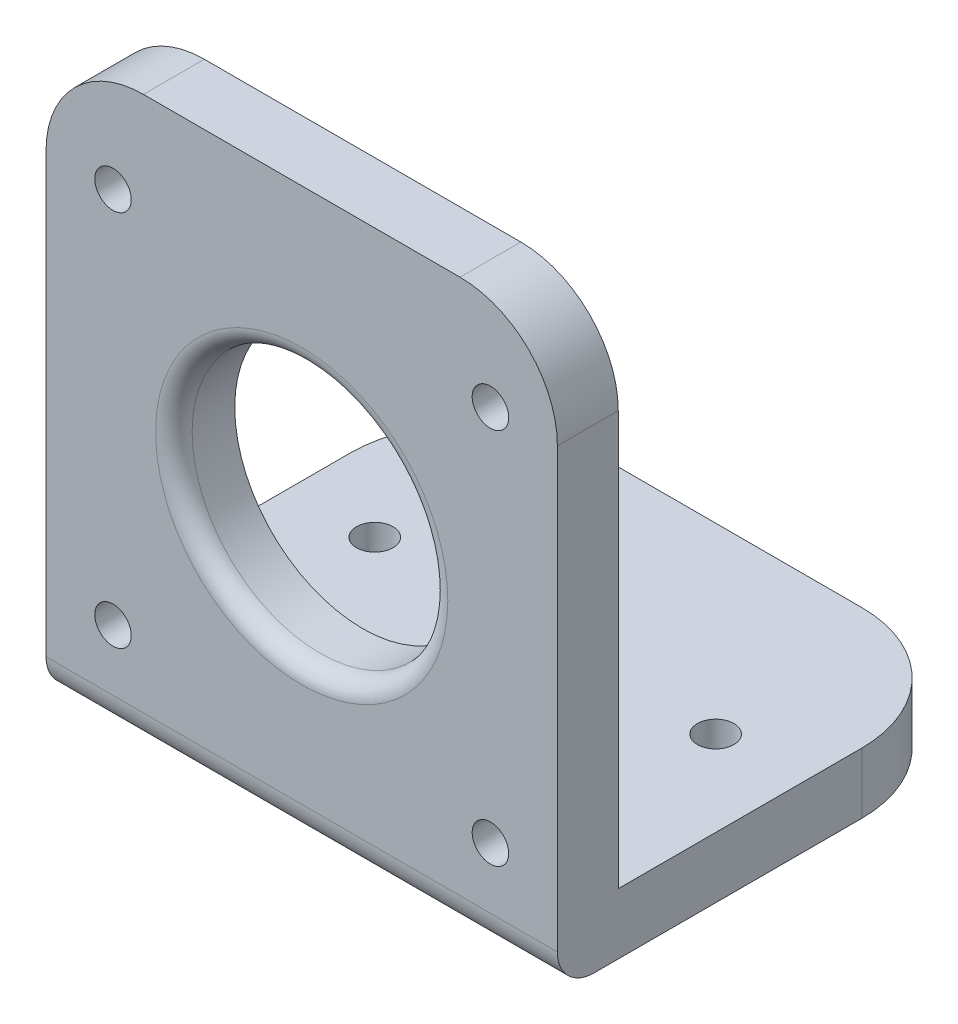
ISO-10303-21;
HEADER;
FILE_DESCRIPTION(('STEP AP214'),'2;1');
FILE_NAME('part.step','',(''),(''),'','','');
FILE_SCHEMA(('AUTOMOTIVE_DESIGN { 1 0 10303 214 1 1 1 1 }'));
ENDSEC;
DATA;
#1=APPLICATION_CONTEXT('core data for automotive mechanical design processes');
#2=APPLICATION_PROTOCOL_DEFINITION('international standard','automotive_design',2000,#1);
#3=PRODUCT_CONTEXT('',#1,'mechanical');
#4=PRODUCT('Part','Part','',(#3));
#5=PRODUCT_RELATED_PRODUCT_CATEGORY('part','',(#4));
#6=PRODUCT_DEFINITION_FORMATION('','',#4);
#7=PRODUCT_DEFINITION_CONTEXT('part definition',#1,'design');
#8=PRODUCT_DEFINITION('design','',#6,#7);
#9=PRODUCT_DEFINITION_SHAPE('','',#8);
#10=(LENGTH_UNIT() NAMED_UNIT(*) SI_UNIT(.MILLI.,.METRE.));
#11=(NAMED_UNIT(*) PLANE_ANGLE_UNIT() SI_UNIT($,.RADIAN.));
#12=(NAMED_UNIT(*) SI_UNIT($,.STERADIAN.) SOLID_ANGLE_UNIT());
#13=UNCERTAINTY_MEASURE_WITH_UNIT(LENGTH_MEASURE(1.E-05),#10,'distance_accuracy_value','');
#14=(GEOMETRIC_REPRESENTATION_CONTEXT(3) GLOBAL_UNCERTAINTY_ASSIGNED_CONTEXT((#13)) GLOBAL_UNIT_ASSIGNED_CONTEXT((#10,
#11,#12)) REPRESENTATION_CONTEXT('',''));
#15=CARTESIAN_POINT('',(0.,0.,0.));
#16=DIRECTION('',(0.,0.,1.));
#17=DIRECTION('',(1.,0.,0.));
#18=AXIS2_PLACEMENT_3D('',#15,#16,#17);
#19=CARTESIAN_POINT('',(-13.,15.5,0.));
#20=DIRECTION('',(0.,0.,1.));
#21=DIRECTION('',(1.,0.,0.));
#22=AXIS2_PLACEMENT_3D('',#19,#20,#21);
#23=PLANE('',#22);
#24=CARTESIAN_POINT('',(-15.5,15.5,0.));
#25=DIRECTION('',(0.,0.,-1.));
#26=DIRECTION('',(-1.,0.,0.));
#27=AXIS2_PLACEMENT_3D('',#24,#25,#26);
#28=CIRCLE('',#27,1.5);
#29=CARTESIAN_POINT('',(-17.,15.5,0.));
#30=VERTEX_POINT('',#29);
#31=EDGE_CURVE('E473',#30,#30,#28,.T.);
#32=ORIENTED_EDGE('',*,*,#31,.F.);
#33=EDGE_LOOP('',(#32));
#34=FACE_BOUND('',#33,.T.);
#35=CARTESIAN_POINT('',(15.4999996870756,-15.5000003129244,0.));
#36=DIRECTION('',(0.,0.,-1.));
#37=DIRECTION('',(-1.,0.,0.));
#38=AXIS2_PLACEMENT_3D('',#35,#36,#37);
#39=CIRCLE('',#38,1.49999957892929);
#40=CARTESIAN_POINT('',(14.0000001081463,-15.5000003129244,0.));
#41=VERTEX_POINT('',#40);
#42=EDGE_CURVE('E466',#41,#41,#39,.T.);
#43=ORIENTED_EDGE('',*,*,#42,.F.);
#44=EDGE_LOOP('',(#43));
#45=FACE_BOUND('',#44,.T.);
#46=CARTESIAN_POINT('',(-15.5,-15.5,0.));
#47=DIRECTION('',(0.,0.,-1.));
#48=DIRECTION('',(-1.,0.,0.));
#49=AXIS2_PLACEMENT_3D('',#46,#47,#48);
#50=CIRCLE('',#49,1.5);
#51=CARTESIAN_POINT('',(-17.,-15.5,0.));
#52=VERTEX_POINT('',#51);
#53=EDGE_CURVE('E478',#52,#52,#50,.T.);
#54=ORIENTED_EDGE('',*,*,#53,.F.);
#55=EDGE_LOOP('',(#54));
#56=FACE_BOUND('',#55,.T.);
#57=CARTESIAN_POINT('',(15.5,15.5,0.));
#58=DIRECTION('',(0.,0.,-1.));
#59=DIRECTION('',(-1.,0.,0.));
#60=AXIS2_PLACEMENT_3D('',#57,#58,#59);
#61=CIRCLE('',#60,1.5);
#62=CARTESIAN_POINT('',(14.,15.5,0.));
#63=VERTEX_POINT('',#62);
#64=EDGE_CURVE('E460',#63,#63,#61,.T.);
#65=ORIENTED_EDGE('',*,*,#64,.F.);
#66=EDGE_LOOP('',(#65));
#67=FACE_BOUND('',#66,.T.);
#68=CARTESIAN_POINT('',(0.,0.,0.));
#69=DIRECTION('',(0.,0.,1.));
#70=DIRECTION('',(1.,0.,0.));
#71=AXIS2_PLACEMENT_3D('',#68,#69,#70);
#72=CIRCLE('',#71,10.5);
#73=CARTESIAN_POINT('',(10.5,0.,0.));
#74=VERTEX_POINT('',#73);
#75=EDGE_CURVE('E136',#74,#74,#72,.T.);
#76=ORIENTED_EDGE('',*,*,#75,.T.);
#77=EDGE_LOOP('',(#76));
#78=FACE_BOUND('',#77,.T.);
#79=DIRECTION('',(1.,0.,0.));
#80=VECTOR('',#79,1.);
#81=CARTESIAN_POINT('',(21.,-18.5,0.));
#82=LINE('',#81,#80);
#83=CARTESIAN_POINT('',(-21.,-18.5,0.));
#84=VERTEX_POINT('',#83);
#85=CARTESIAN_POINT('',(21.,-18.5,0.));
#86=VERTEX_POINT('',#85);
#87=EDGE_CURVE('E131',#84,#86,#82,.T.);
#88=ORIENTED_EDGE('',*,*,#87,.F.);
#89=DIRECTION('',(0.,-1.,0.));
#90=VECTOR('',#89,1.);
#91=CARTESIAN_POINT('',(-21.,15.4999999999999,0.));
#92=LINE('',#91,#90);
#93=CARTESIAN_POINT('',(-21.,15.4999999999999,0.));
#94=VERTEX_POINT('',#93);
#95=EDGE_CURVE('E156',#94,#84,#92,.T.);
#96=ORIENTED_EDGE('',*,*,#95,.F.);
#97=CARTESIAN_POINT('',(-13.,15.5,0.));
#98=DIRECTION('',(0.,0.,1.));
#99=DIRECTION('',(1.,0.,0.));
#100=AXIS2_PLACEMENT_3D('',#97,#98,#99);
#101=CIRCLE('',#100,8.);
#102=CARTESIAN_POINT('',(-12.9999999999999,23.5,0.));
#103=VERTEX_POINT('',#102);
#104=EDGE_CURVE('E169',#103,#94,#101,.T.);
#105=ORIENTED_EDGE('',*,*,#104,.F.);
#106=DIRECTION('',(-1.,0.,0.));
#107=VECTOR('',#106,1.);
#108=CARTESIAN_POINT('',(-12.9999999999999,23.5,0.));
#109=LINE('',#108,#107);
#110=CARTESIAN_POINT('',(12.9999999999999,23.5,0.));
#111=VERTEX_POINT('',#110);
#112=EDGE_CURVE('E167',#111,#103,#109,.T.);
#113=ORIENTED_EDGE('',*,*,#112,.F.);
#114=CARTESIAN_POINT('',(13.,15.5,0.));
#115=DIRECTION('',(0.,0.,1.));
#116=DIRECTION('',(-1.,0.,0.));
#117=AXIS2_PLACEMENT_3D('',#114,#115,#116);
#118=CIRCLE('',#117,8.);
#119=CARTESIAN_POINT('',(21.,15.4999999999999,0.));
#120=VERTEX_POINT('',#119);
#121=EDGE_CURVE('E134',#120,#111,#118,.T.);
#122=ORIENTED_EDGE('',*,*,#121,.F.);
#123=DIRECTION('',(0.,1.,0.));
#124=VECTOR('',#123,1.);
#125=CARTESIAN_POINT('',(21.,15.4999999999999,0.));
#126=LINE('',#125,#124);
#127=EDGE_CURVE('E118',#86,#120,#126,.T.);
#128=ORIENTED_EDGE('',*,*,#127,.F.);
#129=EDGE_LOOP('',(#88,#96,#105,#113,#122,#128));
#130=FACE_BOUND('',#129,.T.);
#131=ADVANCED_FACE('F33',(#34,#45,#56,#67,#78,#130),#23,.F.);
#132=CARTESIAN_POINT('',(-13.,15.5,5.));
#133=DIRECTION('',(0.,0.,1.));
#134=DIRECTION('',(1.,0.,0.));
#135=AXIS2_PLACEMENT_3D('',#132,#133,#134);
#136=PLANE('',#135);
#137=CARTESIAN_POINT('',(0.,0.,5.));
#138=DIRECTION('',(0.,0.,1.));
#139=DIRECTION('',(1.,0.,0.));
#140=AXIS2_PLACEMENT_3D('',#137,#138,#139);
#141=CIRCLE('',#140,12.);
#142=CARTESIAN_POINT('',(12.,0.,5.));
#143=VERTEX_POINT('',#142);
#144=EDGE_CURVE('E11',#143,#143,#141,.F.);
#145=ORIENTED_EDGE('',*,*,#144,.T.);
#146=EDGE_LOOP('',(#145));
#147=FACE_BOUND('',#146,.T.);
#148=CARTESIAN_POINT('',(-15.5,15.5,5.));
#149=DIRECTION('',(0.,0.,-1.));
#150=DIRECTION('',(-1.,0.,0.));
#151=AXIS2_PLACEMENT_3D('',#148,#149,#150);
#152=CIRCLE('',#151,1.5);
#153=CARTESIAN_POINT('',(-17.,15.5,5.));
#154=VERTEX_POINT('',#153);
#155=EDGE_CURVE('E463',#154,#154,#152,.T.);
#156=ORIENTED_EDGE('',*,*,#155,.T.);
#157=EDGE_LOOP('',(#156));
#158=FACE_BOUND('',#157,.T.);
#159=CARTESIAN_POINT('',(15.4999996870756,-15.5000003129244,5.));
#160=DIRECTION('',(0.,0.,-1.));
#161=DIRECTION('',(-1.,0.,0.));
#162=AXIS2_PLACEMENT_3D('',#159,#160,#161);
#163=CIRCLE('',#162,1.49999957892929);
#164=CARTESIAN_POINT('',(14.0000001081463,-15.5000003129244,5.));
#165=VERTEX_POINT('',#164);
#166=EDGE_CURVE('E469',#165,#165,#163,.T.);
#167=ORIENTED_EDGE('',*,*,#166,.T.);
#168=EDGE_LOOP('',(#167));
#169=FACE_BOUND('',#168,.T.);
#170=CARTESIAN_POINT('',(-15.5,-15.5,5.));
#171=DIRECTION('',(0.,0.,-1.));
#172=DIRECTION('',(-1.,0.,0.));
#173=AXIS2_PLACEMENT_3D('',#170,#171,#172);
#174=CIRCLE('',#173,1.5);
#175=CARTESIAN_POINT('',(-17.,-15.5,5.));
#176=VERTEX_POINT('',#175);
#177=EDGE_CURVE('E470',#176,#176,#174,.T.);
#178=ORIENTED_EDGE('',*,*,#177,.T.);
#179=EDGE_LOOP('',(#178));
#180=FACE_BOUND('',#179,.T.);
#181=CARTESIAN_POINT('',(15.5,15.5,5.));
#182=DIRECTION('',(0.,0.,-1.));
#183=DIRECTION('',(-1.,0.,0.));
#184=AXIS2_PLACEMENT_3D('',#181,#182,#183);
#185=CIRCLE('',#184,1.5);
#186=CARTESIAN_POINT('',(14.,15.5,5.));
#187=VERTEX_POINT('',#186);
#188=EDGE_CURVE('E458',#187,#187,#185,.T.);
#189=ORIENTED_EDGE('',*,*,#188,.T.);
#190=EDGE_LOOP('',(#189));
#191=FACE_BOUND('',#190,.T.);
#192=DIRECTION('',(0.,-1.,0.));
#193=VECTOR('',#192,1.);
#194=CARTESIAN_POINT('',(-21.,15.4999999999999,5.));
#195=LINE('',#194,#193);
#196=CARTESIAN_POINT('',(-21.,15.4999999999999,5.));
#197=VERTEX_POINT('',#196);
#198=CARTESIAN_POINT('',(-21.,-20.5,5.));
#199=VERTEX_POINT('',#198);
#200=EDGE_CURVE('E162',#197,#199,#195,.T.);
#201=ORIENTED_EDGE('',*,*,#200,.T.);
#202=DIRECTION('',(1.,0.,0.));
#203=VECTOR('',#202,1.);
#204=CARTESIAN_POINT('',(21.,-20.5,5.));
#205=LINE('',#204,#203);
#206=CARTESIAN_POINT('',(21.,-20.5,5.));
#207=VERTEX_POINT('',#206);
#208=EDGE_CURVE('E205',#199,#207,#205,.T.);
#209=ORIENTED_EDGE('',*,*,#208,.T.);
#210=DIRECTION('',(0.,1.,0.));
#211=VECTOR('',#210,1.);
#212=CARTESIAN_POINT('',(21.,15.4999999999999,5.));
#213=LINE('',#212,#211);
#214=CARTESIAN_POINT('',(21.,15.4999999999999,5.));
#215=VERTEX_POINT('',#214);
#216=EDGE_CURVE('E153',#207,#215,#213,.T.);
#217=ORIENTED_EDGE('',*,*,#216,.T.);
#218=CARTESIAN_POINT('',(13.,15.5,5.));
#219=DIRECTION('',(0.,0.,1.));
#220=DIRECTION('',(-1.,0.,0.));
#221=AXIS2_PLACEMENT_3D('',#218,#219,#220);
#222=CIRCLE('',#221,8.);
#223=CARTESIAN_POINT('',(12.9999999999999,23.5,5.));
#224=VERTEX_POINT('',#223);
#225=EDGE_CURVE('E155',#215,#224,#222,.T.);
#226=ORIENTED_EDGE('',*,*,#225,.T.);
#227=DIRECTION('',(-1.,0.,0.));
#228=VECTOR('',#227,1.);
#229=CARTESIAN_POINT('',(-12.9999999999999,23.5,5.));
#230=LINE('',#229,#228);
#231=CARTESIAN_POINT('',(-12.9999999999999,23.5,5.));
#232=VERTEX_POINT('',#231);
#233=EDGE_CURVE('E158',#224,#232,#230,.T.);
#234=ORIENTED_EDGE('',*,*,#233,.T.);
#235=CARTESIAN_POINT('',(-13.,15.5,5.));
#236=DIRECTION('',(0.,0.,1.));
#237=DIRECTION('',(1.,0.,0.));
#238=AXIS2_PLACEMENT_3D('',#235,#236,#237);
#239=CIRCLE('',#238,8.);
#240=EDGE_CURVE('E160',#232,#197,#239,.T.);
#241=ORIENTED_EDGE('',*,*,#240,.T.);
#242=EDGE_LOOP('',(#201,#209,#217,#226,#234,#241));
#243=FACE_BOUND('',#242,.T.);
#244=ADVANCED_FACE('F228',(#147,#158,#169,#180,#191,#243),#136,.T.);
#245=CARTESIAN_POINT('',(21.,15.4999999999999,5.));
#246=DIRECTION('',(-1.,0.,0.));
#247=DIRECTION('',(0.,-1.,0.));
#248=AXIS2_PLACEMENT_3D('',#245,#246,#247);
#249=PLANE('',#248);
#250=ORIENTED_EDGE('',*,*,#216,.F.);
#251=CARTESIAN_POINT('',(21.,-20.5,2.));
#252=DIRECTION('',(-1.,0.,0.));
#253=DIRECTION('',(0.,-1.,0.));
#254=AXIS2_PLACEMENT_3D('',#251,#252,#253);
#255=CIRCLE('',#254,3.);
#256=CARTESIAN_POINT('',(21.,-23.5,2.));
#257=VERTEX_POINT('',#256);
#258=EDGE_CURVE('E56',#207,#257,#255,.F.);
#259=ORIENTED_EDGE('',*,*,#258,.T.);
#260=DIRECTION('',(0.,0.,-1.));
#261=VECTOR('',#260,1.);
#262=CARTESIAN_POINT('',(21.,-23.5,5.));
#263=LINE('',#262,#261);
#264=CARTESIAN_POINT('',(21.,-23.5,-20.));
#265=VERTEX_POINT('',#264);
#266=EDGE_CURVE('E164',#257,#265,#263,.T.);
#267=ORIENTED_EDGE('',*,*,#266,.T.);
#268=DIRECTION('',(0.,-1.,0.));
#269=VECTOR('',#268,1.);
#270=CARTESIAN_POINT('',(21.,-18.5,-20.));
#271=LINE('',#270,#269);
#272=CARTESIAN_POINT('',(21.,-18.5,-20.));
#273=VERTEX_POINT('',#272);
#274=EDGE_CURVE('E121',#265,#273,#271,.F.);
#275=ORIENTED_EDGE('',*,*,#274,.T.);
#276=DIRECTION('',(0.,0.,1.));
#277=VECTOR('',#276,1.);
#278=CARTESIAN_POINT('',(21.,-18.5,-30.));
#279=LINE('',#278,#277);
#280=EDGE_CURVE('E114',#273,#86,#279,.T.);
#281=ORIENTED_EDGE('',*,*,#280,.T.);
#282=ORIENTED_EDGE('',*,*,#127,.T.);
#283=DIRECTION('',(0.,0.,-1.));
#284=VECTOR('',#283,1.);
#285=CARTESIAN_POINT('',(21.,15.4999999999999,5.));
#286=LINE('',#285,#284);
#287=EDGE_CURVE('E184',#215,#120,#286,.T.);
#288=ORIENTED_EDGE('',*,*,#287,.F.);
#289=EDGE_LOOP('',(#250,#259,#267,#275,#281,#282,#288));
#290=FACE_BOUND('',#289,.T.);
#291=ADVANCED_FACE('F116',(#290),#249,.F.);
#292=CARTESIAN_POINT('',(13.,15.5,5.));
#293=DIRECTION('',(0.,0.,-1.));
#294=DIRECTION('',(-1.,0.,0.));
#295=AXIS2_PLACEMENT_3D('',#292,#293,#294);
#296=CYLINDRICAL_SURFACE('',#295,8.);
#297=ORIENTED_EDGE('',*,*,#121,.T.);
#298=DIRECTION('',(0.,0.,-1.));
#299=VECTOR('',#298,1.);
#300=CARTESIAN_POINT('',(12.9999999999999,23.5,5.));
#301=LINE('',#300,#299);
#302=EDGE_CURVE('E181',#224,#111,#301,.T.);
#303=ORIENTED_EDGE('',*,*,#302,.F.);
#304=ORIENTED_EDGE('',*,*,#225,.F.);
#305=ORIENTED_EDGE('',*,*,#287,.T.);
#306=EDGE_LOOP('',(#297,#303,#304,#305));
#307=FACE_BOUND('',#306,.T.);
#308=ADVANCED_FACE('F257',(#307),#296,.T.);
#309=CARTESIAN_POINT('',(-12.9999999999999,23.5,5.));
#310=DIRECTION('',(0.,-1.,0.));
#311=DIRECTION('',(0.,0.,-1.));
#312=AXIS2_PLACEMENT_3D('',#309,#310,#311);
#313=PLANE('',#312);
#314=ORIENTED_EDGE('',*,*,#112,.T.);
#315=DIRECTION('',(0.,0.,-1.));
#316=VECTOR('',#315,1.);
#317=CARTESIAN_POINT('',(-12.9999999999999,23.5,5.));
#318=LINE('',#317,#316);
#319=EDGE_CURVE('E178',#232,#103,#318,.T.);
#320=ORIENTED_EDGE('',*,*,#319,.F.);
#321=ORIENTED_EDGE('',*,*,#233,.F.);
#322=ORIENTED_EDGE('',*,*,#302,.T.);
#323=EDGE_LOOP('',(#314,#320,#321,#322));
#324=FACE_BOUND('',#323,.T.);
#325=ADVANCED_FACE('F253',(#324),#313,.F.);
#326=CARTESIAN_POINT('',(-13.,15.5,5.));
#327=DIRECTION('',(0.,0.,-1.));
#328=DIRECTION('',(-1.,0.,0.));
#329=AXIS2_PLACEMENT_3D('',#326,#327,#328);
#330=CYLINDRICAL_SURFACE('',#329,8.);
#331=ORIENTED_EDGE('',*,*,#104,.T.);
#332=DIRECTION('',(0.,0.,-1.));
#333=VECTOR('',#332,1.);
#334=CARTESIAN_POINT('',(-21.,15.4999999999999,5.));
#335=LINE('',#334,#333);
#336=EDGE_CURVE('E175',#197,#94,#335,.T.);
#337=ORIENTED_EDGE('',*,*,#336,.F.);
#338=ORIENTED_EDGE('',*,*,#240,.F.);
#339=ORIENTED_EDGE('',*,*,#319,.T.);
#340=EDGE_LOOP('',(#331,#337,#338,#339));
#341=FACE_BOUND('',#340,.T.);
#342=ADVANCED_FACE('F249',(#341),#330,.T.);
#343=CARTESIAN_POINT('',(-21.,15.4999999999999,5.));
#344=DIRECTION('',(1.,0.,0.));
#345=DIRECTION('',(0.,1.,0.));
#346=AXIS2_PLACEMENT_3D('',#343,#344,#345);
#347=PLANE('',#346);
#348=DIRECTION('',(0.,0.,-1.));
#349=VECTOR('',#348,1.);
#350=CARTESIAN_POINT('',(-21.,-23.5,5.));
#351=LINE('',#350,#349);
#352=CARTESIAN_POINT('',(-21.,-23.5,2.));
#353=VERTEX_POINT('',#352);
#354=CARTESIAN_POINT('',(-21.,-23.5,-20.));
#355=VERTEX_POINT('',#354);
#356=EDGE_CURVE('E173',#353,#355,#351,.T.);
#357=ORIENTED_EDGE('',*,*,#356,.F.);
#358=CARTESIAN_POINT('',(-21.,-20.5,2.));
#359=DIRECTION('',(1.,0.,0.));
#360=DIRECTION('',(0.,1.,0.));
#361=AXIS2_PLACEMENT_3D('',#358,#359,#360);
#362=CIRCLE('',#361,3.);
#363=EDGE_CURVE('E210',#353,#199,#362,.F.);
#364=ORIENTED_EDGE('',*,*,#363,.T.);
#365=ORIENTED_EDGE('',*,*,#200,.F.);
#366=ORIENTED_EDGE('',*,*,#336,.T.);
#367=ORIENTED_EDGE('',*,*,#95,.T.);
#368=DIRECTION('',(0.,0.,1.));
#369=VECTOR('',#368,1.);
#370=CARTESIAN_POINT('',(-21.,-18.5,-30.));
#371=LINE('',#370,#369);
#372=CARTESIAN_POINT('',(-21.,-18.5,-20.));
#373=VERTEX_POINT('',#372);
#374=EDGE_CURVE('E125',#373,#84,#371,.T.);
#375=ORIENTED_EDGE('',*,*,#374,.F.);
#376=DIRECTION('',(0.,1.,0.));
#377=VECTOR('',#376,1.);
#378=CARTESIAN_POINT('',(-21.,-23.5,-20.));
#379=LINE('',#378,#377);
#380=EDGE_CURVE('E202',#373,#355,#379,.F.);
#381=ORIENTED_EDGE('',*,*,#380,.T.);
#382=EDGE_LOOP('',(#357,#364,#365,#366,#367,#375,#381));
#383=FACE_BOUND('',#382,.T.);
#384=ADVANCED_FACE('F245',(#383),#347,.F.);
#385=CARTESIAN_POINT('',(-21.,-23.5,5.));
#386=DIRECTION('',(0.,1.,0.));
#387=DIRECTION('',(0.,0.,1.));
#388=AXIS2_PLACEMENT_3D('',#385,#386,#387);
#389=PLANE('',#388);
#390=CARTESIAN_POINT('',(-14.,-23.5,-15.));
#391=DIRECTION('',(0.,1.,0.));
#392=DIRECTION('',(0.,0.,1.));
#393=AXIS2_PLACEMENT_3D('',#390,#391,#392);
#394=CIRCLE('',#393,1.5);
#395=CARTESIAN_POINT('',(-14.,-23.5,-13.5));
#396=VERTEX_POINT('',#395);
#397=EDGE_CURVE('E141',#396,#396,#394,.T.);
#398=ORIENTED_EDGE('',*,*,#397,.T.);
#399=EDGE_LOOP('',(#398));
#400=FACE_BOUND('',#399,.T.);
#401=CARTESIAN_POINT('',(14.,-23.5,-15.));
#402=DIRECTION('',(0.,1.,0.));
#403=DIRECTION('',(0.,0.,1.));
#404=AXIS2_PLACEMENT_3D('',#401,#402,#403);
#405=CIRCLE('',#404,1.5);
#406=CARTESIAN_POINT('',(14.,-23.5,-13.5));
#407=VERTEX_POINT('',#406);
#408=EDGE_CURVE('E146',#407,#407,#405,.T.);
#409=ORIENTED_EDGE('',*,*,#408,.T.);
#410=EDGE_LOOP('',(#409));
#411=FACE_BOUND('',#410,.T.);
#412=ORIENTED_EDGE('',*,*,#266,.F.);
#413=DIRECTION('',(1.,0.,0.));
#414=VECTOR('',#413,1.);
#415=CARTESIAN_POINT('',(-21.,-23.5,2.));
#416=LINE('',#415,#414);
#417=EDGE_CURVE('E48',#257,#353,#416,.F.);
#418=ORIENTED_EDGE('',*,*,#417,.T.);
#419=ORIENTED_EDGE('',*,*,#356,.T.);
#420=CARTESIAN_POINT('',(-11.,-23.5,-20.));
#421=DIRECTION('',(0.,1.,0.));
#422=DIRECTION('',(0.,0.,1.));
#423=AXIS2_PLACEMENT_3D('',#420,#421,#422);
#424=CIRCLE('',#423,10.);
#425=CARTESIAN_POINT('',(-11.,-23.5,-30.));
#426=VERTEX_POINT('',#425);
#427=EDGE_CURVE('E192',#355,#426,#424,.F.);
#428=ORIENTED_EDGE('',*,*,#427,.T.);
#429=DIRECTION('',(-1.,0.,0.));
#430=VECTOR('',#429,1.);
#431=CARTESIAN_POINT('',(21.,-23.5,-30.));
#432=LINE('',#431,#430);
#433=CARTESIAN_POINT('',(11.,-23.5,-30.));
#434=VERTEX_POINT('',#433);
#435=EDGE_CURVE('E140',#434,#426,#432,.T.);
#436=ORIENTED_EDGE('',*,*,#435,.F.);
#437=CARTESIAN_POINT('',(11.,-23.5,-20.));
#438=DIRECTION('',(0.,1.,0.));
#439=DIRECTION('',(0.,0.,1.));
#440=AXIS2_PLACEMENT_3D('',#437,#438,#439);
#441=CIRCLE('',#440,10.);
#442=EDGE_CURVE('E194',#434,#265,#441,.F.);
#443=ORIENTED_EDGE('',*,*,#442,.T.);
#444=EDGE_LOOP('',(#412,#418,#419,#428,#436,#443));
#445=FACE_BOUND('',#444,.T.);
#446=ADVANCED_FACE('F242',(#400,#411,#445),#389,.F.);
#447=CARTESIAN_POINT('',(0.,0.,5.));
#448=DIRECTION('',(0.,0.,-1.));
#449=DIRECTION('',(-1.,0.,0.));
#450=AXIS2_PLACEMENT_3D('',#447,#448,#449);
#451=CYLINDRICAL_SURFACE('',#450,10.5);
#452=CARTESIAN_POINT('',(0.,0.,3.5));
#453=DIRECTION('',(0.,0.,1.));
#454=DIRECTION('',(1.,0.,0.));
#455=AXIS2_PLACEMENT_3D('',#452,#453,#454);
#456=CIRCLE('',#455,10.5);
#457=CARTESIAN_POINT('',(10.5,0.,3.5));
#458=VERTEX_POINT('',#457);
#459=EDGE_CURVE('E41',#458,#458,#456,.T.);
#460=ORIENTED_EDGE('',*,*,#459,.T.);
#461=EDGE_LOOP('',(#460));
#462=FACE_BOUND('',#461,.T.);
#463=ORIENTED_EDGE('',*,*,#75,.F.);
#464=EDGE_LOOP('',(#463));
#465=FACE_BOUND('',#464,.T.);
#466=ADVANCED_FACE('F214',(#462,#465),#451,.F.);
#467=CARTESIAN_POINT('',(21.,-18.5,-30.));
#468=DIRECTION('',(0.,-1.,0.));
#469=DIRECTION('',(0.,0.,-1.));
#470=AXIS2_PLACEMENT_3D('',#467,#468,#469);
#471=PLANE('',#470);
#472=CARTESIAN_POINT('',(-14.,-18.5,-15.));
#473=DIRECTION('',(0.,1.,0.));
#474=DIRECTION('',(0.,0.,1.));
#475=AXIS2_PLACEMENT_3D('',#472,#473,#474);
#476=CIRCLE('',#475,1.5);
#477=CARTESIAN_POINT('',(-14.,-18.5,-13.5));
#478=VERTEX_POINT('',#477);
#479=EDGE_CURVE('E447',#478,#478,#476,.T.);
#480=ORIENTED_EDGE('',*,*,#479,.F.);
#481=EDGE_LOOP('',(#480));
#482=FACE_BOUND('',#481,.T.);
#483=CARTESIAN_POINT('',(14.,-18.5,-15.));
#484=DIRECTION('',(0.,1.,0.));
#485=DIRECTION('',(0.,0.,-1.));
#486=AXIS2_PLACEMENT_3D('',#483,#484,#485);
#487=CIRCLE('',#486,1.5);
#488=CARTESIAN_POINT('',(14.,-18.5,-16.5));
#489=VERTEX_POINT('',#488);
#490=EDGE_CURVE('E454',#489,#489,#487,.T.);
#491=ORIENTED_EDGE('',*,*,#490,.F.);
#492=EDGE_LOOP('',(#491));
#493=FACE_BOUND('',#492,.T.);
#494=ORIENTED_EDGE('',*,*,#280,.F.);
#495=CARTESIAN_POINT('',(11.,-18.5,-20.));
#496=DIRECTION('',(0.,-1.,0.));
#497=DIRECTION('',(0.,0.,-1.));
#498=AXIS2_PLACEMENT_3D('',#495,#496,#497);
#499=CIRCLE('',#498,10.);
#500=CARTESIAN_POINT('',(11.,-18.5,-30.));
#501=VERTEX_POINT('',#500);
#502=EDGE_CURVE('E200',#273,#501,#499,.F.);
#503=ORIENTED_EDGE('',*,*,#502,.T.);
#504=DIRECTION('',(1.,0.,0.));
#505=VECTOR('',#504,1.);
#506=CARTESIAN_POINT('',(21.,-18.5,-30.));
#507=LINE('',#506,#505);
#508=CARTESIAN_POINT('',(-11.,-18.5,-30.));
#509=VERTEX_POINT('',#508);
#510=EDGE_CURVE('E126',#509,#501,#507,.T.);
#511=ORIENTED_EDGE('',*,*,#510,.F.);
#512=CARTESIAN_POINT('',(-11.,-18.5,-20.));
#513=DIRECTION('',(0.,-1.,0.));
#514=DIRECTION('',(0.,0.,-1.));
#515=AXIS2_PLACEMENT_3D('',#512,#513,#514);
#516=CIRCLE('',#515,10.);
#517=EDGE_CURVE('E198',#509,#373,#516,.F.);
#518=ORIENTED_EDGE('',*,*,#517,.T.);
#519=ORIENTED_EDGE('',*,*,#374,.T.);
#520=ORIENTED_EDGE('',*,*,#87,.T.);
#521=EDGE_LOOP('',(#494,#503,#511,#518,#519,#520));
#522=FACE_BOUND('',#521,.T.);
#523=ADVANCED_FACE('F138',(#482,#493,#522),#471,.F.);
#524=CARTESIAN_POINT('',(0.,0.,-30.));
#525=DIRECTION('',(0.,0.,-1.));
#526=DIRECTION('',(-1.,0.,0.));
#527=AXIS2_PLACEMENT_3D('',#524,#525,#526);
#528=PLANE('',#527);
#529=ORIENTED_EDGE('',*,*,#510,.T.);
#530=DIRECTION('',(0.,-1.,0.));
#531=VECTOR('',#530,1.);
#532=CARTESIAN_POINT('',(11.,-23.5,-30.));
#533=LINE('',#532,#531);
#534=EDGE_CURVE('E189',#501,#434,#533,.T.);
#535=ORIENTED_EDGE('',*,*,#534,.T.);
#536=ORIENTED_EDGE('',*,*,#435,.T.);
#537=DIRECTION('',(0.,1.,0.));
#538=VECTOR('',#537,1.);
#539=CARTESIAN_POINT('',(-11.,-18.5,-30.));
#540=LINE('',#539,#538);
#541=EDGE_CURVE('E186',#426,#509,#540,.T.);
#542=ORIENTED_EDGE('',*,*,#541,.T.);
#543=EDGE_LOOP('',(#529,#535,#536,#542));
#544=FACE_BOUND('',#543,.T.);
#545=ADVANCED_FACE('F298',(#544),#528,.T.);
#546=CARTESIAN_POINT('',(14.,-48.5,-15.));
#547=DIRECTION('',(0.,1.,0.));
#548=DIRECTION('',(0.,0.,1.));
#549=AXIS2_PLACEMENT_3D('',#546,#547,#548);
#550=CYLINDRICAL_SURFACE('',#549,1.5);
#551=ORIENTED_EDGE('',*,*,#490,.T.);
#552=EDGE_LOOP('',(#551));
#553=FACE_BOUND('',#552,.T.);
#554=ORIENTED_EDGE('',*,*,#408,.F.);
#555=EDGE_LOOP('',(#554));
#556=FACE_BOUND('',#555,.T.);
#557=ADVANCED_FACE('F302',(#553,#556),#550,.F.);
#558=CARTESIAN_POINT('',(-14.,-48.5,-15.));
#559=DIRECTION('',(0.,1.,0.));
#560=DIRECTION('',(0.,0.,1.));
#561=AXIS2_PLACEMENT_3D('',#558,#559,#560);
#562=CYLINDRICAL_SURFACE('',#561,1.5);
#563=ORIENTED_EDGE('',*,*,#479,.T.);
#564=EDGE_LOOP('',(#563));
#565=FACE_BOUND('',#564,.T.);
#566=ORIENTED_EDGE('',*,*,#397,.F.);
#567=EDGE_LOOP('',(#566));
#568=FACE_BOUND('',#567,.T.);
#569=ADVANCED_FACE('F268',(#565,#568),#562,.F.);
#570=CARTESIAN_POINT('',(11.,0.,-20.));
#571=DIRECTION('',(0.,1.,0.));
#572=DIRECTION('',(-1.,0.,0.));
#573=AXIS2_PLACEMENT_3D('',#570,#571,#572);
#574=CYLINDRICAL_SURFACE('',#573,10.);
#575=ORIENTED_EDGE('',*,*,#502,.F.);
#576=ORIENTED_EDGE('',*,*,#274,.F.);
#577=ORIENTED_EDGE('',*,*,#442,.F.);
#578=ORIENTED_EDGE('',*,*,#534,.F.);
#579=EDGE_LOOP('',(#575,#576,#577,#578));
#580=FACE_BOUND('',#579,.T.);
#581=ADVANCED_FACE('F264',(#580),#574,.T.);
#582=CARTESIAN_POINT('',(-11.,0.,-20.));
#583=DIRECTION('',(0.,-1.,0.));
#584=DIRECTION('',(1.,0.,0.));
#585=AXIS2_PLACEMENT_3D('',#582,#583,#584);
#586=CYLINDRICAL_SURFACE('',#585,10.);
#587=ORIENTED_EDGE('',*,*,#427,.F.);
#588=ORIENTED_EDGE('',*,*,#380,.F.);
#589=ORIENTED_EDGE('',*,*,#517,.F.);
#590=ORIENTED_EDGE('',*,*,#541,.F.);
#591=EDGE_LOOP('',(#587,#588,#589,#590));
#592=FACE_BOUND('',#591,.T.);
#593=ADVANCED_FACE('F267',(#592),#586,.T.);
#594=CARTESIAN_POINT('',(-13.,-20.5,2.));
#595=DIRECTION('',(-1.,0.,0.));
#596=DIRECTION('',(0.,0.,1.));
#597=AXIS2_PLACEMENT_3D('',#594,#595,#596);
#598=CYLINDRICAL_SURFACE('',#597,3.);
#599=ORIENTED_EDGE('',*,*,#363,.F.);
#600=ORIENTED_EDGE('',*,*,#417,.F.);
#601=ORIENTED_EDGE('',*,*,#258,.F.);
#602=ORIENTED_EDGE('',*,*,#208,.F.);
#603=EDGE_LOOP('',(#599,#600,#601,#602));
#604=FACE_BOUND('',#603,.T.);
#605=ADVANCED_FACE('F271',(#604),#598,.T.);
#606=CARTESIAN_POINT('',(15.5,15.5,5.));
#607=DIRECTION('',(0.,0.,-1.));
#608=DIRECTION('',(-1.,0.,0.));
#609=AXIS2_PLACEMENT_3D('',#606,#607,#608);
#610=CYLINDRICAL_SURFACE('',#609,1.5);
#611=ORIENTED_EDGE('',*,*,#188,.F.);
#612=EDGE_LOOP('',(#611));
#613=FACE_BOUND('',#612,.T.);
#614=ORIENTED_EDGE('',*,*,#64,.T.);
#615=EDGE_LOOP('',(#614));
#616=FACE_BOUND('',#615,.T.);
#617=ADVANCED_FACE('F274',(#613,#616),#610,.F.);
#618=CARTESIAN_POINT('',(-15.5,-15.5,5.));
#619=DIRECTION('',(0.,0.,-1.));
#620=DIRECTION('',(-1.,0.,0.));
#621=AXIS2_PLACEMENT_3D('',#618,#619,#620);
#622=CYLINDRICAL_SURFACE('',#621,1.5);
#623=ORIENTED_EDGE('',*,*,#177,.F.);
#624=EDGE_LOOP('',(#623));
#625=FACE_BOUND('',#624,.T.);
#626=ORIENTED_EDGE('',*,*,#53,.T.);
#627=EDGE_LOOP('',(#626));
#628=FACE_BOUND('',#627,.T.);
#629=ADVANCED_FACE('F278',(#625,#628),#622,.F.);
#630=CARTESIAN_POINT('',(15.4999996870756,-15.5000003129244,5.));
#631=DIRECTION('',(0.,0.,-1.));
#632=DIRECTION('',(-1.,0.,0.));
#633=AXIS2_PLACEMENT_3D('',#630,#631,#632);
#634=CYLINDRICAL_SURFACE('',#633,1.49999957892929);
#635=ORIENTED_EDGE('',*,*,#166,.F.);
#636=EDGE_LOOP('',(#635));
#637=FACE_BOUND('',#636,.T.);
#638=ORIENTED_EDGE('',*,*,#42,.T.);
#639=EDGE_LOOP('',(#638));
#640=FACE_BOUND('',#639,.T.);
#641=ADVANCED_FACE('F223',(#637,#640),#634,.F.);
#642=CARTESIAN_POINT('',(-15.5,15.5,5.));
#643=DIRECTION('',(0.,0.,-1.));
#644=DIRECTION('',(-1.,0.,0.));
#645=AXIS2_PLACEMENT_3D('',#642,#643,#644);
#646=CYLINDRICAL_SURFACE('',#645,1.5);
#647=ORIENTED_EDGE('',*,*,#155,.F.);
#648=EDGE_LOOP('',(#647));
#649=FACE_BOUND('',#648,.T.);
#650=ORIENTED_EDGE('',*,*,#31,.T.);
#651=EDGE_LOOP('',(#650));
#652=FACE_BOUND('',#651,.T.);
#653=ADVANCED_FACE('F218',(#649,#652),#646,.F.);
#654=CARTESIAN_POINT('',(0.,0.,3.5));
#655=DIRECTION('',(0.,0.,1.));
#656=DIRECTION('',(1.,0.,0.));
#657=AXIS2_PLACEMENT_3D('',#654,#655,#656);
#658=TOROIDAL_SURFACE('',#657,12.,1.5);
#659=ORIENTED_EDGE('',*,*,#144,.F.);
#660=EDGE_LOOP('',(#659));
#661=FACE_BOUND('',#660,.T.);
#662=ORIENTED_EDGE('',*,*,#459,.F.);
#663=EDGE_LOOP('',(#662));
#664=FACE_BOUND('',#663,.T.);
#665=ADVANCED_FACE('F35',(#661,#664),#658,.T.);
#666=CLOSED_SHELL('',(#131,#244,#291,#308,#325,#342,#384,#446,#466,#523,#545,#557,#569,#581,
#593,#605,#617,#629,#641,#653,#665));
#667=MANIFOLD_SOLID_BREP('B2',#666);
#668=ADVANCED_BREP_SHAPE_REPRESENTATION('',(#18,#667),#14);
#669=SHAPE_DEFINITION_REPRESENTATION(#9,#668);
ENDSEC;
END-ISO-10303-21;
